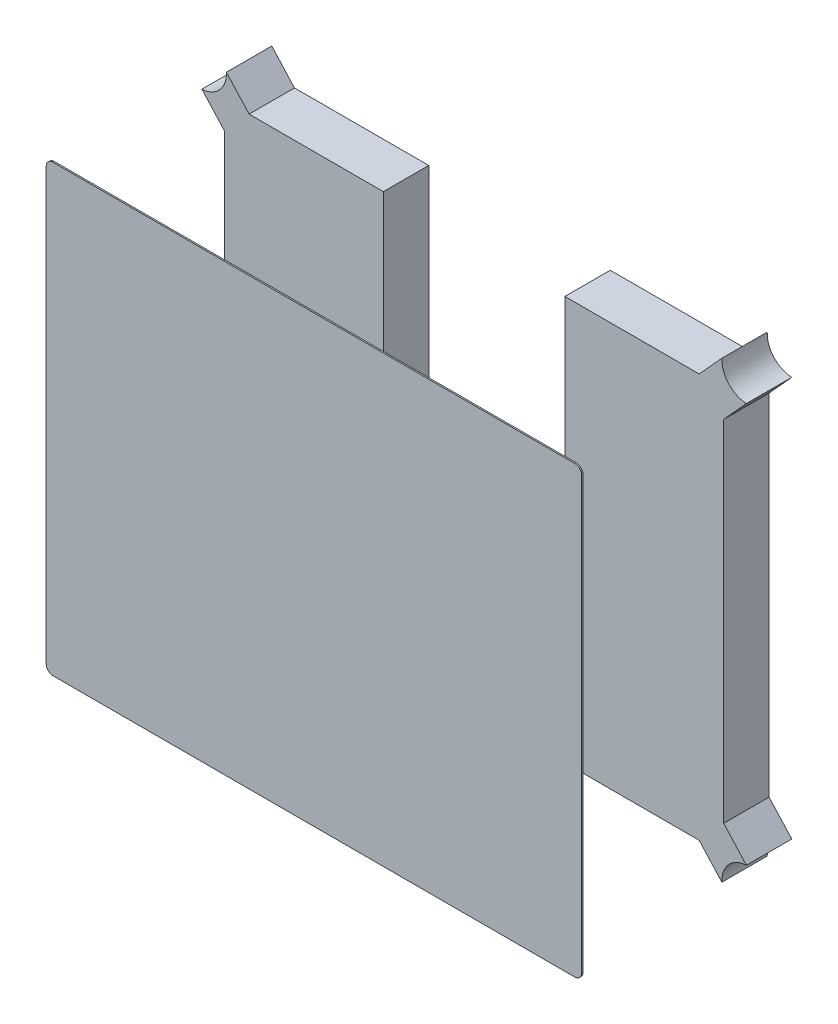
ISO-10303-21;
HEADER;
FILE_DESCRIPTION(('STEP AP214'),'2;1');
FILE_NAME('part.step','',(''),(''),'','','');
FILE_SCHEMA(('AUTOMOTIVE_DESIGN { 1 0 10303 214 1 1 1 1 }'));
ENDSEC;
DATA;
#1=APPLICATION_CONTEXT('core data for automotive mechanical design processes');
#2=APPLICATION_PROTOCOL_DEFINITION('international standard','automotive_design',2000,#1);
#3=PRODUCT_CONTEXT('',#1,'mechanical');
#4=PRODUCT('Part','Part','',(#3));
#5=PRODUCT_RELATED_PRODUCT_CATEGORY('part','',(#4));
#6=PRODUCT_DEFINITION_FORMATION('','',#4);
#7=PRODUCT_DEFINITION_CONTEXT('part definition',#1,'design');
#8=PRODUCT_DEFINITION('design','',#6,#7);
#9=PRODUCT_DEFINITION_SHAPE('','',#8);
#10=(LENGTH_UNIT() NAMED_UNIT(*) SI_UNIT(.MILLI.,.METRE.));
#11=(NAMED_UNIT(*) PLANE_ANGLE_UNIT() SI_UNIT($,.RADIAN.));
#12=(NAMED_UNIT(*) SI_UNIT($,.STERADIAN.) SOLID_ANGLE_UNIT());
#13=UNCERTAINTY_MEASURE_WITH_UNIT(LENGTH_MEASURE(1.E-05),#10,'distance_accuracy_value','');
#14=(GEOMETRIC_REPRESENTATION_CONTEXT(3) GLOBAL_UNCERTAINTY_ASSIGNED_CONTEXT((#13)) GLOBAL_UNIT_ASSIGNED_CONTEXT((#10,
#11,#12)) REPRESENTATION_CONTEXT('',''));
#15=CARTESIAN_POINT('',(0.,0.,0.));
#16=DIRECTION('',(0.,0.,1.));
#17=DIRECTION('',(1.,0.,0.));
#18=AXIS2_PLACEMENT_3D('',#15,#16,#17);
#19=CARTESIAN_POINT('',(-5.75000066,3.74999934,0.45));
#20=DIRECTION('',(0.,0.,1.));
#21=DIRECTION('',(1.,0.,0.));
#22=AXIS2_PLACEMENT_3D('',#19,#20,#21);
#23=PLANE('',#22);
#24=DIRECTION('',(1.,0.,0.));
#25=VECTOR('',#24,1.);
#26=CARTESIAN_POINT('',(-6.32500066,3.25999934,0.45));
#27=LINE('',#26,#25);
#28=CARTESIAN_POINT('',(-6.32500066,3.25999934,0.45));
#29=VERTEX_POINT('',#28);
#30=CARTESIAN_POINT('',(-5.17500066,3.25999934,0.45));
#31=VERTEX_POINT('',#30);
#32=EDGE_CURVE('P0_E82',#29,#31,#27,.T.);
#33=ORIENTED_EDGE('',*,*,#32,.F.);
#34=CARTESIAN_POINT('',(-6.32500066,3.27499934,0.45));
#35=DIRECTION('',(0.,0.,1.));
#36=DIRECTION('',(1.,0.,0.));
#37=AXIS2_PLACEMENT_3D('',#34,#35,#36);
#38=CIRCLE('',#37,0.015);
#39=CARTESIAN_POINT('',(-6.34000066,3.27499934,0.45));
#40=VERTEX_POINT('',#39);
#41=EDGE_CURVE('P0_E98',#40,#29,#38,.T.);
#42=ORIENTED_EDGE('',*,*,#41,.F.);
#43=DIRECTION('',(0.,1.,0.));
#44=VECTOR('',#43,1.);
#45=CARTESIAN_POINT('',(-6.34000066,4.22499934,0.45));
#46=LINE('',#45,#44);
#47=CARTESIAN_POINT('',(-6.34000066,4.22499934,0.45));
#48=VERTEX_POINT('',#47);
#49=EDGE_CURVE('P0_E104',#48,#40,#46,.F.);
#50=ORIENTED_EDGE('',*,*,#49,.F.);
#51=CARTESIAN_POINT('',(-6.32500066,4.22499934,0.45));
#52=DIRECTION('',(0.,0.,1.));
#53=DIRECTION('',(1.,0.,0.));
#54=AXIS2_PLACEMENT_3D('',#51,#52,#53);
#55=CIRCLE('',#54,0.015);
#56=CARTESIAN_POINT('',(-6.32500066,4.23999934,0.45));
#57=VERTEX_POINT('',#56);
#58=EDGE_CURVE('P0_E128',#57,#48,#55,.T.);
#59=ORIENTED_EDGE('',*,*,#58,.F.);
#60=DIRECTION('',(1.,0.,0.));
#61=VECTOR('',#60,1.);
#62=CARTESIAN_POINT('',(-5.17500066,4.23999934,0.45));
#63=LINE('',#62,#61);
#64=CARTESIAN_POINT('',(-5.17500066,4.23999934,0.45));
#65=VERTEX_POINT('',#64);
#66=EDGE_CURVE('P0_E109',#65,#57,#63,.F.);
#67=ORIENTED_EDGE('',*,*,#66,.F.);
#68=CARTESIAN_POINT('',(-5.17500066,4.22499934,0.45));
#69=DIRECTION('',(0.,0.,1.));
#70=DIRECTION('',(1.,0.,0.));
#71=AXIS2_PLACEMENT_3D('',#68,#69,#70);
#72=CIRCLE('',#71,0.015);
#73=CARTESIAN_POINT('',(-5.16000066,4.22499934,0.45));
#74=VERTEX_POINT('',#73);
#75=EDGE_CURVE('P0_E130',#74,#65,#72,.T.);
#76=ORIENTED_EDGE('',*,*,#75,.F.);
#77=DIRECTION('',(0.,1.,0.));
#78=VECTOR('',#77,1.);
#79=CARTESIAN_POINT('',(-5.16000066,3.27499934,0.45));
#80=LINE('',#79,#78);
#81=CARTESIAN_POINT('',(-5.16000066,3.27499934,0.45));
#82=VERTEX_POINT('',#81);
#83=EDGE_CURVE('P0_E84',#82,#74,#80,.T.);
#84=ORIENTED_EDGE('',*,*,#83,.F.);
#85=CARTESIAN_POINT('',(-5.17500066,3.27499934,0.45));
#86=DIRECTION('',(0.,0.,1.));
#87=DIRECTION('',(1.,0.,0.));
#88=AXIS2_PLACEMENT_3D('',#85,#86,#87);
#89=CIRCLE('',#88,0.015);
#90=EDGE_CURVE('P0_E20',#31,#82,#89,.T.);
#91=ORIENTED_EDGE('',*,*,#90,.F.);
#92=EDGE_LOOP('',(#33,#42,#50,#59,#67,#76,#84,#91));
#93=FACE_BOUND('',#92,.T.);
#94=ADVANCED_FACE('P0_F17',(#93),#23,.F.);
#95=CARTESIAN_POINT('',(-5.17500066,3.27499934,0.45));
#96=DIRECTION('',(0.,0.,1.));
#97=DIRECTION('',(1.,0.,0.));
#98=AXIS2_PLACEMENT_3D('',#95,#96,#97);
#99=CYLINDRICAL_SURFACE('',#98,0.015);
#100=CARTESIAN_POINT('',(-5.17500066,3.27499934,0.453));
#101=DIRECTION('',(0.,0.,1.));
#102=DIRECTION('',(1.,0.,0.));
#103=AXIS2_PLACEMENT_3D('',#100,#101,#102);
#104=CIRCLE('',#103,0.015);
#105=CARTESIAN_POINT('',(-5.17500066,3.25999934,0.453));
#106=VERTEX_POINT('',#105);
#107=CARTESIAN_POINT('',(-5.16000066,3.27499934,0.453));
#108=VERTEX_POINT('',#107);
#109=EDGE_CURVE('P0_E91',#106,#108,#104,.T.);
#110=ORIENTED_EDGE('',*,*,#109,.F.);
#111=DIRECTION('',(0.,0.,-1.));
#112=VECTOR('',#111,1.);
#113=CARTESIAN_POINT('',(-5.17500066,3.25999934,0.45));
#114=LINE('',#113,#112);
#115=EDGE_CURVE('P0_E88',#31,#106,#114,.F.);
#116=ORIENTED_EDGE('',*,*,#115,.F.);
#117=ORIENTED_EDGE('',*,*,#90,.T.);
#118=DIRECTION('',(0.,0.,-1.));
#119=VECTOR('',#118,1.);
#120=CARTESIAN_POINT('',(-5.16000066,3.27499934,0.45));
#121=LINE('',#120,#119);
#122=EDGE_CURVE('P0_E102',#108,#82,#121,.T.);
#123=ORIENTED_EDGE('',*,*,#122,.F.);
#124=EDGE_LOOP('',(#110,#116,#117,#123));
#125=FACE_BOUND('',#124,.T.);
#126=ADVANCED_FACE('P0_F89',(#125),#99,.T.);
#127=CARTESIAN_POINT('',(-5.16000066,3.27499934,0.45));
#128=DIRECTION('',(1.,0.,0.));
#129=DIRECTION('',(0.,0.,-1.));
#130=AXIS2_PLACEMENT_3D('',#127,#128,#129);
#131=PLANE('',#130);
#132=DIRECTION('',(0.,1.,0.));
#133=VECTOR('',#132,1.);
#134=CARTESIAN_POINT('',(-5.16000066,3.74999934,0.453));
#135=LINE('',#134,#133);
#136=CARTESIAN_POINT('',(-5.16000066,4.22499934,0.453));
#137=VERTEX_POINT('',#136);
#138=EDGE_CURVE('P0_E125',#108,#137,#135,.T.);
#139=ORIENTED_EDGE('',*,*,#138,.F.);
#140=ORIENTED_EDGE('',*,*,#122,.T.);
#141=ORIENTED_EDGE('',*,*,#83,.T.);
#142=DIRECTION('',(0.,0.,1.));
#143=VECTOR('',#142,1.);
#144=CARTESIAN_POINT('',(-5.16000066,4.22499934,0.45));
#145=LINE('',#144,#143);
#146=EDGE_CURVE('P0_E113',#137,#74,#145,.F.);
#147=ORIENTED_EDGE('',*,*,#146,.F.);
#148=EDGE_LOOP('',(#139,#140,#141,#147));
#149=FACE_BOUND('',#148,.T.);
#150=ADVANCED_FACE('P0_F137',(#149),#131,.T.);
#151=CARTESIAN_POINT('',(-5.17500066,4.22499934,0.45));
#152=DIRECTION('',(0.,0.,1.));
#153=DIRECTION('',(1.,0.,0.));
#154=AXIS2_PLACEMENT_3D('',#151,#152,#153);
#155=CYLINDRICAL_SURFACE('',#154,0.015);
#156=CARTESIAN_POINT('',(-5.17500066,4.22499934,0.453));
#157=DIRECTION('',(0.,0.,1.));
#158=DIRECTION('',(1.,0.,0.));
#159=AXIS2_PLACEMENT_3D('',#156,#157,#158);
#160=CIRCLE('',#159,0.015);
#161=CARTESIAN_POINT('',(-5.17500066,4.23999934,0.453));
#162=VERTEX_POINT('',#161);
#163=EDGE_CURVE('P0_E122',#137,#162,#160,.T.);
#164=ORIENTED_EDGE('',*,*,#163,.F.);
#165=ORIENTED_EDGE('',*,*,#146,.T.);
#166=ORIENTED_EDGE('',*,*,#75,.T.);
#167=DIRECTION('',(0.,0.,1.));
#168=VECTOR('',#167,1.);
#169=CARTESIAN_POINT('',(-5.17500066,4.23999934,0.45));
#170=LINE('',#169,#168);
#171=EDGE_CURVE('P0_E112',#162,#65,#170,.F.);
#172=ORIENTED_EDGE('',*,*,#171,.F.);
#173=EDGE_LOOP('',(#164,#165,#166,#172));
#174=FACE_BOUND('',#173,.T.);
#175=ADVANCED_FACE('P0_F160',(#174),#155,.T.);
#176=CARTESIAN_POINT('',(-5.17500066,4.23999934,0.45));
#177=DIRECTION('',(0.,1.,0.));
#178=DIRECTION('',(0.,0.,1.));
#179=AXIS2_PLACEMENT_3D('',#176,#177,#178);
#180=PLANE('',#179);
#181=DIRECTION('',(1.,0.,0.));
#182=VECTOR('',#181,1.);
#183=CARTESIAN_POINT('',(-5.75000066,4.23999934,0.453));
#184=LINE('',#183,#182);
#185=CARTESIAN_POINT('',(-6.32500066,4.23999934,0.453));
#186=VERTEX_POINT('',#185);
#187=EDGE_CURVE('P0_E121',#162,#186,#184,.F.);
#188=ORIENTED_EDGE('',*,*,#187,.F.);
#189=ORIENTED_EDGE('',*,*,#171,.T.);
#190=ORIENTED_EDGE('',*,*,#66,.T.);
#191=DIRECTION('',(0.,0.,1.));
#192=VECTOR('',#191,1.);
#193=CARTESIAN_POINT('',(-6.32500066,4.23999934,0.45));
#194=LINE('',#193,#192);
#195=EDGE_CURVE('P0_E108',#186,#57,#194,.F.);
#196=ORIENTED_EDGE('',*,*,#195,.F.);
#197=EDGE_LOOP('',(#188,#189,#190,#196));
#198=FACE_BOUND('',#197,.T.);
#199=ADVANCED_FACE('P0_F159',(#198),#180,.T.);
#200=CARTESIAN_POINT('',(-6.32500066,4.22499934,0.45));
#201=DIRECTION('',(0.,0.,1.));
#202=DIRECTION('',(1.,0.,0.));
#203=AXIS2_PLACEMENT_3D('',#200,#201,#202);
#204=CYLINDRICAL_SURFACE('',#203,0.015);
#205=CARTESIAN_POINT('',(-6.32500066,4.22499934,0.453));
#206=DIRECTION('',(0.,0.,1.));
#207=DIRECTION('',(1.,0.,0.));
#208=AXIS2_PLACEMENT_3D('',#205,#206,#207);
#209=CIRCLE('',#208,0.015);
#210=CARTESIAN_POINT('',(-6.34000066,4.22499934,0.453));
#211=VERTEX_POINT('',#210);
#212=EDGE_CURVE('P0_E118',#186,#211,#209,.T.);
#213=ORIENTED_EDGE('',*,*,#212,.F.);
#214=ORIENTED_EDGE('',*,*,#195,.T.);
#215=ORIENTED_EDGE('',*,*,#58,.T.);
#216=DIRECTION('',(0.,0.,1.));
#217=VECTOR('',#216,1.);
#218=CARTESIAN_POINT('',(-6.34000066,4.22499934,0.45));
#219=LINE('',#218,#217);
#220=EDGE_CURVE('P0_E107',#211,#48,#219,.F.);
#221=ORIENTED_EDGE('',*,*,#220,.F.);
#222=EDGE_LOOP('',(#213,#214,#215,#221));
#223=FACE_BOUND('',#222,.T.);
#224=ADVANCED_FACE('P0_F152',(#223),#204,.T.);
#225=CARTESIAN_POINT('',(-6.34000066,4.22499934,0.45));
#226=DIRECTION('',(-1.,0.,0.));
#227=DIRECTION('',(0.,0.,1.));
#228=AXIS2_PLACEMENT_3D('',#225,#226,#227);
#229=PLANE('',#228);
#230=DIRECTION('',(0.,1.,0.));
#231=VECTOR('',#230,1.);
#232=CARTESIAN_POINT('',(-6.34000066,3.74999934,0.453));
#233=LINE('',#232,#231);
#234=CARTESIAN_POINT('',(-6.34000066,3.27499934,0.453));
#235=VERTEX_POINT('',#234);
#236=EDGE_CURVE('P0_E117',#211,#235,#233,.F.);
#237=ORIENTED_EDGE('',*,*,#236,.F.);
#238=ORIENTED_EDGE('',*,*,#220,.T.);
#239=ORIENTED_EDGE('',*,*,#49,.T.);
#240=DIRECTION('',(0.,0.,1.));
#241=VECTOR('',#240,1.);
#242=CARTESIAN_POINT('',(-6.34000066,3.27499934,0.45));
#243=LINE('',#242,#241);
#244=EDGE_CURVE('P0_E95',#235,#40,#243,.F.);
#245=ORIENTED_EDGE('',*,*,#244,.F.);
#246=EDGE_LOOP('',(#237,#238,#239,#245));
#247=FACE_BOUND('',#246,.T.);
#248=ADVANCED_FACE('P0_F147',(#247),#229,.T.);
#249=CARTESIAN_POINT('',(-6.32500066,3.27499934,0.45));
#250=DIRECTION('',(0.,0.,1.));
#251=DIRECTION('',(1.,0.,0.));
#252=AXIS2_PLACEMENT_3D('',#249,#250,#251);
#253=CYLINDRICAL_SURFACE('',#252,0.015);
#254=CARTESIAN_POINT('',(-6.32500066,3.27499934,0.453));
#255=DIRECTION('',(0.,0.,1.));
#256=DIRECTION('',(1.,0.,0.));
#257=AXIS2_PLACEMENT_3D('',#254,#255,#256);
#258=CIRCLE('',#257,0.015);
#259=CARTESIAN_POINT('',(-6.32500066,3.25999934,0.453));
#260=VERTEX_POINT('',#259);
#261=EDGE_CURVE('P0_E26',#235,#260,#258,.T.);
#262=ORIENTED_EDGE('',*,*,#261,.F.);
#263=ORIENTED_EDGE('',*,*,#244,.T.);
#264=ORIENTED_EDGE('',*,*,#41,.T.);
#265=DIRECTION('',(0.,0.,-1.));
#266=VECTOR('',#265,1.);
#267=CARTESIAN_POINT('',(-6.32500066,3.25999934,0.45));
#268=LINE('',#267,#266);
#269=EDGE_CURVE('P0_E35',#260,#29,#268,.T.);
#270=ORIENTED_EDGE('',*,*,#269,.F.);
#271=EDGE_LOOP('',(#262,#263,#264,#270));
#272=FACE_BOUND('',#271,.T.);
#273=ADVANCED_FACE('P0_F145',(#272),#253,.T.);
#274=CARTESIAN_POINT('',(-6.32500066,3.25999934,0.45));
#275=DIRECTION('',(0.,-1.,0.));
#276=DIRECTION('',(0.,0.,-1.));
#277=AXIS2_PLACEMENT_3D('',#274,#275,#276);
#278=PLANE('',#277);
#279=DIRECTION('',(1.,0.,0.));
#280=VECTOR('',#279,1.);
#281=CARTESIAN_POINT('',(-5.75000066,3.25999934,0.453));
#282=LINE('',#281,#280);
#283=EDGE_CURVE('P0_E11',#260,#106,#282,.T.);
#284=ORIENTED_EDGE('',*,*,#283,.F.);
#285=ORIENTED_EDGE('',*,*,#269,.T.);
#286=ORIENTED_EDGE('',*,*,#32,.T.);
#287=ORIENTED_EDGE('',*,*,#115,.T.);
#288=EDGE_LOOP('',(#284,#285,#286,#287));
#289=FACE_BOUND('',#288,.T.);
#290=ADVANCED_FACE('P0_F94',(#289),#278,.T.);
#291=CARTESIAN_POINT('',(-5.75000066,3.74999934,0.453));
#292=DIRECTION('',(0.,0.,1.));
#293=DIRECTION('',(1.,0.,0.));
#294=AXIS2_PLACEMENT_3D('',#291,#292,#293);
#295=PLANE('',#294);
#296=ORIENTED_EDGE('',*,*,#261,.T.);
#297=ORIENTED_EDGE('',*,*,#283,.T.);
#298=ORIENTED_EDGE('',*,*,#109,.T.);
#299=ORIENTED_EDGE('',*,*,#138,.T.);
#300=ORIENTED_EDGE('',*,*,#163,.T.);
#301=ORIENTED_EDGE('',*,*,#187,.T.);
#302=ORIENTED_EDGE('',*,*,#212,.T.);
#303=ORIENTED_EDGE('',*,*,#236,.T.);
#304=EDGE_LOOP('',(#296,#297,#298,#299,#300,#301,#302,#303));
#305=FACE_BOUND('',#304,.T.);
#306=ADVANCED_FACE('P0_F142',(#305),#295,.T.);
#307=CLOSED_SHELL('',(#94,#126,#150,#175,#199,#224,#248,#273,#290,#306));
#308=MANIFOLD_SOLID_BREP('P0_B1',#307);
#309=CARTESIAN_POINT('',(-5.35000066,3.74999934,0.));
#310=DIRECTION('',(0.,0.,1.));
#311=DIRECTION('',(1.,0.,0.));
#312=AXIS2_PLACEMENT_3D('',#309,#310,#311);
#313=PLANE('',#312);
#314=DIRECTION('',(0.672672793996113,-0.739940073396125,0.));
#315=VECTOR('',#314,1.);
#316=CARTESIAN_POINT('',(-5.254059091808,3.30499934,0.));
#317=LINE('',#316,#315);
#318=CARTESIAN_POINT('',(-5.254059091808,3.30499934,0.));
#319=VERTEX_POINT('',#318);
#320=CARTESIAN_POINT('',(-5.20405909180848,3.24999934000049,0.));
#321=VERTEX_POINT('',#320);
#322=EDGE_CURVE('P1_E125',#319,#321,#317,.T.);
#323=ORIENTED_EDGE('',*,*,#322,.F.);
#324=DIRECTION('',(1.,0.,0.));
#325=VECTOR('',#324,1.);
#326=CARTESIAN_POINT('',(-5.55000066,3.30499934,0.));
#327=LINE('',#326,#325);
#328=CARTESIAN_POINT('',(-5.55000066,3.30499934,0.));
#329=VERTEX_POINT('',#328);
#330=EDGE_CURVE('P1_E119',#329,#319,#327,.T.);
#331=ORIENTED_EDGE('',*,*,#330,.F.);
#332=DIRECTION('',(0.,1.,0.));
#333=VECTOR('',#332,1.);
#334=CARTESIAN_POINT('',(-5.55000066,4.19499934,0.));
#335=LINE('',#334,#333);
#336=CARTESIAN_POINT('',(-5.55000066,4.19499934,0.));
#337=VERTEX_POINT('',#336);
#338=EDGE_CURVE('P1_E129',#337,#329,#335,.F.);
#339=ORIENTED_EDGE('',*,*,#338,.F.);
#340=DIRECTION('',(1.,0.,0.));
#341=VECTOR('',#340,1.);
#342=CARTESIAN_POINT('',(-5.254059091808,4.19499934,0.));
#343=LINE('',#342,#341);
#344=CARTESIAN_POINT('',(-5.25405909180799,4.19499934,0.));
#345=VERTEX_POINT('',#344);
#346=EDGE_CURVE('P1_E135',#345,#337,#343,.F.);
#347=ORIENTED_EDGE('',*,*,#346,.F.);
#348=DIRECTION('',(-0.672672793996113,-0.739940073396125,0.));
#349=VECTOR('',#348,1.);
#350=CARTESIAN_POINT('',(-5.204059091808,4.24999934,0.));
#351=LINE('',#350,#349);
#352=CARTESIAN_POINT('',(-5.20405909180847,4.24999933999948,0.));
#353=VERTEX_POINT('',#352);
#354=EDGE_CURVE('P1_E141',#353,#345,#351,.T.);
#355=ORIENTED_EDGE('',*,*,#354,.F.);
#356=CARTESIAN_POINT('',(-5.147293573392,4.24730020479,0.));
#357=DIRECTION('',(0.,0.,1.));
#358=DIRECTION('',(1.,0.,0.));
#359=AXIS2_PLACEMENT_3D('',#356,#357,#358);
#360=CIRCLE('',#359,0.05682965257698);
#361=CARTESIAN_POINT('',(-5.15000065999996,4.19053506501111,0.));
#362=VERTEX_POINT('',#361);
#363=EDGE_CURVE('P1_E144',#353,#362,#360,.T.);
#364=ORIENTED_EDGE('',*,*,#363,.T.);
#365=DIRECTION('',(0.672672793996113,0.739940073396125,0.));
#366=VECTOR('',#365,1.);
#367=CARTESIAN_POINT('',(-5.20000066,4.135535065011,0.));
#368=LINE('',#367,#366);
#369=CARTESIAN_POINT('',(-5.20000066,4.135535065011,0.));
#370=VERTEX_POINT('',#369);
#371=EDGE_CURVE('P1_E147',#370,#362,#368,.T.);
#372=ORIENTED_EDGE('',*,*,#371,.F.);
#373=DIRECTION('',(0.,1.,0.));
#374=VECTOR('',#373,1.);
#375=CARTESIAN_POINT('',(-5.20000066,3.364463614989,0.));
#376=LINE('',#375,#374);
#377=CARTESIAN_POINT('',(-5.20000065999999,3.364463614989,0.));
#378=VERTEX_POINT('',#377);
#379=EDGE_CURVE('P1_E96',#378,#370,#376,.T.);
#380=ORIENTED_EDGE('',*,*,#379,.F.);
#381=DIRECTION('',(-0.672672793996113,0.739940073396125,0.));
#382=VECTOR('',#381,1.);
#383=CARTESIAN_POINT('',(-5.15000066,3.309463614989,0.));
#384=LINE('',#383,#382);
#385=CARTESIAN_POINT('',(-5.15000065999995,3.30946361498895,0.));
#386=VERTEX_POINT('',#385);
#387=EDGE_CURVE('P1_E92',#386,#378,#384,.T.);
#388=ORIENTED_EDGE('',*,*,#387,.F.);
#389=CARTESIAN_POINT('',(-5.147293573392,3.25269847521,0.));
#390=DIRECTION('',(0.,0.,1.));
#391=DIRECTION('',(1.,0.,0.));
#392=AXIS2_PLACEMENT_3D('',#389,#390,#391);
#393=CIRCLE('',#392,0.05682965257698);
#394=EDGE_CURVE('P1_E20',#386,#321,#393,.T.);
#395=ORIENTED_EDGE('',*,*,#394,.T.);
#396=EDGE_LOOP('',(#323,#331,#339,#347,#355,#364,#372,#380,#388,#395));
#397=FACE_BOUND('',#396,.T.);
#398=ADVANCED_FACE('P1_F17',(#397),#313,.F.);
#399=CARTESIAN_POINT('',(-5.147293573392,3.25269847521,0.));
#400=DIRECTION('',(0.,0.,1.));
#401=DIRECTION('',(1.,0.,0.));
#402=AXIS2_PLACEMENT_3D('',#399,#400,#401);
#403=CYLINDRICAL_SURFACE('',#402,0.05682965257698);
#404=DIRECTION('',(0.,0.,1.));
#405=VECTOR('',#404,1.);
#406=CARTESIAN_POINT('',(-5.15000066,3.309463614989,0.));
#407=LINE('',#406,#405);
#408=CARTESIAN_POINT('',(-5.15000065999995,3.30946361498895,0.1));
#409=VERTEX_POINT('',#408);
#410=EDGE_CURVE('P1_E100',#409,#386,#407,.F.);
#411=ORIENTED_EDGE('',*,*,#410,.F.);
#412=CARTESIAN_POINT('',(-5.147293573392,3.25269847521,0.1));
#413=DIRECTION('',(0.,0.,1.));
#414=DIRECTION('',(1.,0.,0.));
#415=AXIS2_PLACEMENT_3D('',#412,#413,#414);
#416=CIRCLE('',#415,0.05682965257698);
#417=CARTESIAN_POINT('',(-5.20405909180848,3.24999934000051,0.1));
#418=VERTEX_POINT('',#417);
#419=EDGE_CURVE('P1_E161',#418,#409,#416,.F.);
#420=ORIENTED_EDGE('',*,*,#419,.F.);
#421=DIRECTION('',(0.,0.,1.));
#422=VECTOR('',#421,1.);
#423=CARTESIAN_POINT('',(-5.20405909180801,3.24999933999999,0.));
#424=LINE('',#423,#422);
#425=EDGE_CURVE('P1_E106',#321,#418,#424,.T.);
#426=ORIENTED_EDGE('',*,*,#425,.F.);
#427=ORIENTED_EDGE('',*,*,#394,.F.);
#428=EDGE_LOOP('',(#411,#420,#426,#427));
#429=FACE_BOUND('',#428,.T.);
#430=ADVANCED_FACE('P1_F103',(#429),#403,.F.);
#431=CARTESIAN_POINT('',(-5.15000066,3.309463614989,0.));
#432=DIRECTION('',(0.739940073396125,0.672672793996113,0.));
#433=DIRECTION('',(-0.672672793996113,0.739940073396125,0.));
#434=AXIS2_PLACEMENT_3D('',#431,#432,#433);
#435=PLANE('',#434);
#436=DIRECTION('',(-0.672672793996311,0.739940073395945,0.));
#437=VECTOR('',#436,1.);
#438=CARTESIAN_POINT('',(-5.15000066,3.309463614989,0.1));
#439=LINE('',#438,#437);
#440=CARTESIAN_POINT('',(-5.20000066,3.364463614989,0.1));
#441=VERTEX_POINT('',#440);
#442=EDGE_CURVE('P1_E110',#409,#441,#439,.T.);
#443=ORIENTED_EDGE('',*,*,#442,.F.);
#444=ORIENTED_EDGE('',*,*,#410,.T.);
#445=ORIENTED_EDGE('',*,*,#387,.T.);
#446=DIRECTION('',(0.,0.,-1.));
#447=VECTOR('',#446,1.);
#448=CARTESIAN_POINT('',(-5.20000066,3.364463614989,0.));
#449=LINE('',#448,#447);
#450=EDGE_CURVE('P1_E113',#441,#378,#449,.T.);
#451=ORIENTED_EDGE('',*,*,#450,.F.);
#452=EDGE_LOOP('',(#443,#444,#445,#451));
#453=FACE_BOUND('',#452,.T.);
#454=ADVANCED_FACE('P1_F108',(#453),#435,.T.);
#455=CARTESIAN_POINT('',(-5.20000066,3.364463614989,0.));
#456=DIRECTION('',(1.,0.,0.));
#457=DIRECTION('',(0.,0.,-1.));
#458=AXIS2_PLACEMENT_3D('',#455,#456,#457);
#459=PLANE('',#458);
#460=DIRECTION('',(0.,1.,0.));
#461=VECTOR('',#460,1.);
#462=CARTESIAN_POINT('',(-5.20000066,3.74999934,0.1));
#463=LINE('',#462,#461);
#464=CARTESIAN_POINT('',(-5.20000066,4.135535065011,0.1));
#465=VERTEX_POINT('',#464);
#466=EDGE_CURVE('P1_E177',#441,#465,#463,.T.);
#467=ORIENTED_EDGE('',*,*,#466,.F.);
#468=ORIENTED_EDGE('',*,*,#450,.T.);
#469=ORIENTED_EDGE('',*,*,#379,.T.);
#470=DIRECTION('',(0.,0.,1.));
#471=VECTOR('',#470,1.);
#472=CARTESIAN_POINT('',(-5.20000066,4.135535065011,0.));
#473=LINE('',#472,#471);
#474=EDGE_CURVE('P1_E149',#465,#370,#473,.F.);
#475=ORIENTED_EDGE('',*,*,#474,.F.);
#476=EDGE_LOOP('',(#467,#468,#469,#475));
#477=FACE_BOUND('',#476,.T.);
#478=ADVANCED_FACE('P1_F183',(#477),#459,.T.);
#479=CARTESIAN_POINT('',(-5.20000066,4.135535065011,0.));
#480=DIRECTION('',(0.739940073396125,-0.672672793996113,0.));
#481=DIRECTION('',(0.672672793996113,0.739940073396125,0.));
#482=AXIS2_PLACEMENT_3D('',#479,#480,#481);
#483=PLANE('',#482);
#484=DIRECTION('',(0.672672793996314,0.739940073395943,0.));
#485=VECTOR('',#484,1.);
#486=CARTESIAN_POINT('',(-5.20000066,4.135535065011,0.1));
#487=LINE('',#486,#485);
#488=CARTESIAN_POINT('',(-5.15000065999995,4.19053506501111,0.1));
#489=VERTEX_POINT('',#488);
#490=EDGE_CURVE('P1_E160',#465,#489,#487,.T.);
#491=ORIENTED_EDGE('',*,*,#490,.F.);
#492=ORIENTED_EDGE('',*,*,#474,.T.);
#493=ORIENTED_EDGE('',*,*,#371,.T.);
#494=DIRECTION('',(0.,0.,1.));
#495=VECTOR('',#494,1.);
#496=CARTESIAN_POINT('',(-5.15000065999999,4.19053506501111,0.));
#497=LINE('',#496,#495);
#498=EDGE_CURVE('P1_E163',#362,#489,#497,.T.);
#499=ORIENTED_EDGE('',*,*,#498,.T.);
#500=EDGE_LOOP('',(#491,#492,#493,#499));
#501=FACE_BOUND('',#500,.T.);
#502=ADVANCED_FACE('P1_F300',(#501),#483,.T.);
#503=CARTESIAN_POINT('',(-5.147293573392,4.24730020479,0.));
#504=DIRECTION('',(0.,0.,1.));
#505=DIRECTION('',(1.,0.,0.));
#506=AXIS2_PLACEMENT_3D('',#503,#504,#505);
#507=CYLINDRICAL_SURFACE('',#506,0.05682965257698);
#508=DIRECTION('',(0.,0.,1.));
#509=VECTOR('',#508,1.);
#510=CARTESIAN_POINT('',(-5.204059091808,4.24999934,0.));
#511=LINE('',#510,#509);
#512=CARTESIAN_POINT('',(-5.20405909180847,4.24999933999948,0.1));
#513=VERTEX_POINT('',#512);
#514=EDGE_CURVE('P1_E138',#513,#353,#511,.F.);
#515=ORIENTED_EDGE('',*,*,#514,.F.);
#516=CARTESIAN_POINT('',(-5.147293573392,4.24730020479,0.1));
#517=DIRECTION('',(0.,0.,1.));
#518=DIRECTION('',(1.,0.,0.));
#519=AXIS2_PLACEMENT_3D('',#516,#517,#518);
#520=CIRCLE('',#519,0.05682965257698);
#521=EDGE_CURVE('P1_E156',#489,#513,#520,.F.);
#522=ORIENTED_EDGE('',*,*,#521,.F.);
#523=ORIENTED_EDGE('',*,*,#498,.F.);
#524=ORIENTED_EDGE('',*,*,#363,.F.);
#525=EDGE_LOOP('',(#515,#522,#523,#524));
#526=FACE_BOUND('',#525,.T.);
#527=ADVANCED_FACE('P1_F231',(#526),#507,.F.);
#528=CARTESIAN_POINT('',(-5.204059091808,4.24999934,0.));
#529=DIRECTION('',(-0.739940073396125,0.672672793996113,0.));
#530=DIRECTION('',(-0.672672793996113,-0.739940073396125,0.));
#531=AXIS2_PLACEMENT_3D('',#528,#529,#530);
#532=PLANE('',#531);
#533=DIRECTION('',(-0.67267279399632,-0.739940073395937,0.));
#534=VECTOR('',#533,1.);
#535=CARTESIAN_POINT('',(-5.204059091808,4.24999934,0.1));
#536=LINE('',#535,#534);
#537=CARTESIAN_POINT('',(-5.254059091808,4.19499934,0.1));
#538=VERTEX_POINT('',#537);
#539=EDGE_CURVE('P1_E159',#513,#538,#536,.T.);
#540=ORIENTED_EDGE('',*,*,#539,.F.);
#541=ORIENTED_EDGE('',*,*,#514,.T.);
#542=ORIENTED_EDGE('',*,*,#354,.T.);
#543=DIRECTION('',(0.,0.,1.));
#544=VECTOR('',#543,1.);
#545=CARTESIAN_POINT('',(-5.254059091808,4.19499934,0.));
#546=LINE('',#545,#544);
#547=EDGE_CURVE('P1_E132',#538,#345,#546,.F.);
#548=ORIENTED_EDGE('',*,*,#547,.F.);
#549=EDGE_LOOP('',(#540,#541,#542,#548));
#550=FACE_BOUND('',#549,.T.);
#551=ADVANCED_FACE('P1_F228',(#550),#532,.T.);
#552=CARTESIAN_POINT('',(-5.254059091808,4.19499934,0.));
#553=DIRECTION('',(0.,1.,0.));
#554=DIRECTION('',(0.,0.,1.));
#555=AXIS2_PLACEMENT_3D('',#552,#553,#554);
#556=PLANE('',#555);
#557=DIRECTION('',(1.,0.,0.));
#558=VECTOR('',#557,1.);
#559=CARTESIAN_POINT('',(-5.35000066,4.19499934,0.1));
#560=LINE('',#559,#558);
#561=CARTESIAN_POINT('',(-5.55000066,4.19499934,0.1));
#562=VERTEX_POINT('',#561);
#563=EDGE_CURVE('P1_E209',#538,#562,#560,.F.);
#564=ORIENTED_EDGE('',*,*,#563,.F.);
#565=ORIENTED_EDGE('',*,*,#547,.T.);
#566=ORIENTED_EDGE('',*,*,#346,.T.);
#567=DIRECTION('',(0.,0.,1.));
#568=VECTOR('',#567,1.);
#569=CARTESIAN_POINT('',(-5.55000066,4.19499934,0.));
#570=LINE('',#569,#568);
#571=EDGE_CURVE('P1_E122',#562,#337,#570,.F.);
#572=ORIENTED_EDGE('',*,*,#571,.F.);
#573=EDGE_LOOP('',(#564,#565,#566,#572));
#574=FACE_BOUND('',#573,.T.);
#575=ADVANCED_FACE('P1_F224',(#574),#556,.T.);
#576=CARTESIAN_POINT('',(-5.55000066,4.19499934,0.));
#577=DIRECTION('',(-1.,0.,0.));
#578=DIRECTION('',(0.,0.,1.));
#579=AXIS2_PLACEMENT_3D('',#576,#577,#578);
#580=PLANE('',#579);
#581=DIRECTION('',(0.,1.,0.));
#582=VECTOR('',#581,1.);
#583=CARTESIAN_POINT('',(-5.55000066,3.74999934,0.1));
#584=LINE('',#583,#582);
#585=CARTESIAN_POINT('',(-5.55000066,3.30499934,0.1));
#586=VERTEX_POINT('',#585);
#587=EDGE_CURVE('P1_E200',#562,#586,#584,.F.);
#588=ORIENTED_EDGE('',*,*,#587,.F.);
#589=ORIENTED_EDGE('',*,*,#571,.T.);
#590=ORIENTED_EDGE('',*,*,#338,.T.);
#591=DIRECTION('',(0.,0.,-1.));
#592=VECTOR('',#591,1.);
#593=CARTESIAN_POINT('',(-5.55000066,3.30499934,0.));
#594=LINE('',#593,#592);
#595=EDGE_CURVE('P1_E121',#586,#329,#594,.T.);
#596=ORIENTED_EDGE('',*,*,#595,.F.);
#597=EDGE_LOOP('',(#588,#589,#590,#596));
#598=FACE_BOUND('',#597,.T.);
#599=ADVANCED_FACE('P1_F239',(#598),#580,.T.);
#600=CARTESIAN_POINT('',(-5.55000066,3.30499934,0.));
#601=DIRECTION('',(0.,-1.,0.));
#602=DIRECTION('',(0.,0.,-1.));
#603=AXIS2_PLACEMENT_3D('',#600,#601,#602);
#604=PLANE('',#603);
#605=DIRECTION('',(1.,0.,0.));
#606=VECTOR('',#605,1.);
#607=CARTESIAN_POINT('',(-5.35000066,3.30499934,0.1));
#608=LINE('',#607,#606);
#609=CARTESIAN_POINT('',(-5.254059091808,3.30499934,0.1));
#610=VERTEX_POINT('',#609);
#611=EDGE_CURVE('P1_E26',#586,#610,#608,.T.);
#612=ORIENTED_EDGE('',*,*,#611,.F.);
#613=ORIENTED_EDGE('',*,*,#595,.T.);
#614=ORIENTED_EDGE('',*,*,#330,.T.);
#615=DIRECTION('',(0.,0.,1.));
#616=VECTOR('',#615,1.);
#617=CARTESIAN_POINT('',(-5.254059091808,3.30499934,0.));
#618=LINE('',#617,#616);
#619=EDGE_CURVE('P1_E35',#610,#319,#618,.F.);
#620=ORIENTED_EDGE('',*,*,#619,.F.);
#621=EDGE_LOOP('',(#612,#613,#614,#620));
#622=FACE_BOUND('',#621,.T.);
#623=ADVANCED_FACE('P1_F240',(#622),#604,.T.);
#624=CARTESIAN_POINT('',(-5.254059091808,3.30499934,0.));
#625=DIRECTION('',(-0.739940073396125,-0.672672793996113,0.));
#626=DIRECTION('',(0.672672793996113,-0.739940073396125,0.));
#627=AXIS2_PLACEMENT_3D('',#624,#625,#626);
#628=PLANE('',#627);
#629=DIRECTION('',(0.672672793996314,-0.739940073395942,0.));
#630=VECTOR('',#629,1.);
#631=CARTESIAN_POINT('',(-5.254059091808,3.30499934,0.1));
#632=LINE('',#631,#630);
#633=EDGE_CURVE('P1_E11',#610,#418,#632,.T.);
#634=ORIENTED_EDGE('',*,*,#633,.F.);
#635=ORIENTED_EDGE('',*,*,#619,.T.);
#636=ORIENTED_EDGE('',*,*,#322,.T.);
#637=ORIENTED_EDGE('',*,*,#425,.T.);
#638=EDGE_LOOP('',(#634,#635,#636,#637));
#639=FACE_BOUND('',#638,.T.);
#640=ADVANCED_FACE('P1_F242',(#639),#628,.T.);
#641=CARTESIAN_POINT('',(-5.35000066,3.74999934,0.1));
#642=DIRECTION('',(0.,0.,1.));
#643=DIRECTION('',(1.,0.,0.));
#644=AXIS2_PLACEMENT_3D('',#641,#642,#643);
#645=PLANE('',#644);
#646=ORIENTED_EDGE('',*,*,#611,.T.);
#647=ORIENTED_EDGE('',*,*,#633,.T.);
#648=ORIENTED_EDGE('',*,*,#419,.T.);
#649=ORIENTED_EDGE('',*,*,#442,.T.);
#650=ORIENTED_EDGE('',*,*,#466,.T.);
#651=ORIENTED_EDGE('',*,*,#490,.T.);
#652=ORIENTED_EDGE('',*,*,#521,.T.);
#653=ORIENTED_EDGE('',*,*,#539,.T.);
#654=ORIENTED_EDGE('',*,*,#563,.T.);
#655=ORIENTED_EDGE('',*,*,#587,.T.);
#656=EDGE_LOOP('',(#646,#647,#648,#649,#650,#651,#652,#653,#654,#655));
#657=FACE_BOUND('',#656,.T.);
#658=ADVANCED_FACE('P1_F187',(#657),#645,.T.);
#659=CLOSED_SHELL('',(#398,#430,#454,#478,#502,#527,#551,#575,#599,#623,#640,#658));
#660=MANIFOLD_SOLID_BREP('P1_B1',#659);
#661=CARTESIAN_POINT('',(-6.15000066,3.74999934,0.));
#662=DIRECTION('',(0.,0.,1.));
#663=DIRECTION('',(1.,0.,0.));
#664=AXIS2_PLACEMENT_3D('',#661,#662,#663);
#665=PLANE('',#664);
#666=DIRECTION('',(-0.672672793996113,0.739940073396125,0.));
#667=VECTOR('',#666,1.);
#668=CARTESIAN_POINT('',(-6.245942228192,4.19499934,0.));
#669=LINE('',#668,#667);
#670=CARTESIAN_POINT('',(-6.245942228192,4.19499934,0.));
#671=VERTEX_POINT('',#670);
#672=CARTESIAN_POINT('',(-6.29594222819152,4.2499993399995,0.));
#673=VERTEX_POINT('',#672);
#674=EDGE_CURVE('P2_E125',#671,#673,#669,.T.);
#675=ORIENTED_EDGE('',*,*,#674,.F.);
#676=DIRECTION('',(1.,0.,0.));
#677=VECTOR('',#676,1.);
#678=CARTESIAN_POINT('',(-5.95000066,4.19499934,0.));
#679=LINE('',#678,#677);
#680=CARTESIAN_POINT('',(-5.95000066,4.19499934,0.));
#681=VERTEX_POINT('',#680);
#682=EDGE_CURVE('P2_E119',#681,#671,#679,.F.);
#683=ORIENTED_EDGE('',*,*,#682,.F.);
#684=DIRECTION('',(0.,1.,0.));
#685=VECTOR('',#684,1.);
#686=CARTESIAN_POINT('',(-5.95000066,3.30499934,0.));
#687=LINE('',#686,#685);
#688=CARTESIAN_POINT('',(-5.95000066,3.30499934,0.));
#689=VERTEX_POINT('',#688);
#690=EDGE_CURVE('P2_E129',#689,#681,#687,.T.);
#691=ORIENTED_EDGE('',*,*,#690,.F.);
#692=DIRECTION('',(1.,0.,0.));
#693=VECTOR('',#692,1.);
#694=CARTESIAN_POINT('',(-6.245942228192,3.30499934,0.));
#695=LINE('',#694,#693);
#696=CARTESIAN_POINT('',(-6.24594222819201,3.30499934,0.));
#697=VERTEX_POINT('',#696);
#698=EDGE_CURVE('P2_E135',#697,#689,#695,.T.);
#699=ORIENTED_EDGE('',*,*,#698,.F.);
#700=DIRECTION('',(0.672672793996113,0.739940073396125,0.));
#701=VECTOR('',#700,1.);
#702=CARTESIAN_POINT('',(-6.295942228192,3.24999934,0.));
#703=LINE('',#702,#701);
#704=CARTESIAN_POINT('',(-6.29594222819153,3.24999934000052,0.));
#705=VERTEX_POINT('',#704);
#706=EDGE_CURVE('P2_E141',#705,#697,#703,.T.);
#707=ORIENTED_EDGE('',*,*,#706,.F.);
#708=CARTESIAN_POINT('',(-6.352707746608,3.25269847521,0.));
#709=DIRECTION('',(0.,0.,1.));
#710=DIRECTION('',(1.,0.,0.));
#711=AXIS2_PLACEMENT_3D('',#708,#709,#710);
#712=CIRCLE('',#711,0.05682965257698);
#713=CARTESIAN_POINT('',(-6.35000066000004,3.30946361498889,0.));
#714=VERTEX_POINT('',#713);
#715=EDGE_CURVE('P2_E144',#705,#714,#712,.T.);
#716=ORIENTED_EDGE('',*,*,#715,.T.);
#717=DIRECTION('',(-0.672672793996113,-0.739940073396125,0.));
#718=VECTOR('',#717,1.);
#719=CARTESIAN_POINT('',(-6.30000066,3.364463614989,0.));
#720=LINE('',#719,#718);
#721=CARTESIAN_POINT('',(-6.30000066,3.364463614989,0.));
#722=VERTEX_POINT('',#721);
#723=EDGE_CURVE('P2_E147',#722,#714,#720,.T.);
#724=ORIENTED_EDGE('',*,*,#723,.F.);
#725=DIRECTION('',(0.,1.,0.));
#726=VECTOR('',#725,1.);
#727=CARTESIAN_POINT('',(-6.30000066,4.135535065011,0.));
#728=LINE('',#727,#726);
#729=CARTESIAN_POINT('',(-6.30000066000001,4.135535065011,0.));
#730=VERTEX_POINT('',#729);
#731=EDGE_CURVE('P2_E96',#730,#722,#728,.F.);
#732=ORIENTED_EDGE('',*,*,#731,.F.);
#733=DIRECTION('',(0.672672793996113,-0.739940073396125,0.));
#734=VECTOR('',#733,1.);
#735=CARTESIAN_POINT('',(-6.35000066,4.190535065011,0.));
#736=LINE('',#735,#734);
#737=CARTESIAN_POINT('',(-6.35000066000005,4.19053506501105,0.));
#738=VERTEX_POINT('',#737);
#739=EDGE_CURVE('P2_E92',#738,#730,#736,.T.);
#740=ORIENTED_EDGE('',*,*,#739,.F.);
#741=CARTESIAN_POINT('',(-6.352707746608,4.24730020479,0.));
#742=DIRECTION('',(0.,0.,1.));
#743=DIRECTION('',(1.,0.,0.));
#744=AXIS2_PLACEMENT_3D('',#741,#742,#743);
#745=CIRCLE('',#744,0.05682965257698);
#746=EDGE_CURVE('P2_E20',#738,#673,#745,.T.);
#747=ORIENTED_EDGE('',*,*,#746,.T.);
#748=EDGE_LOOP('',(#675,#683,#691,#699,#707,#716,#724,#732,#740,#747));
#749=FACE_BOUND('',#748,.T.);
#750=ADVANCED_FACE('P2_F17',(#749),#665,.F.);
#751=CARTESIAN_POINT('',(-6.352707746608,4.24730020479,0.));
#752=DIRECTION('',(0.,0.,1.));
#753=DIRECTION('',(1.,0.,0.));
#754=AXIS2_PLACEMENT_3D('',#751,#752,#753);
#755=CYLINDRICAL_SURFACE('',#754,0.05682965257698);
#756=DIRECTION('',(0.,0.,1.));
#757=VECTOR('',#756,1.);
#758=CARTESIAN_POINT('',(-6.35000066,4.190535065011,0.));
#759=LINE('',#758,#757);
#760=CARTESIAN_POINT('',(-6.35000066000005,4.19053506501105,0.1));
#761=VERTEX_POINT('',#760);
#762=EDGE_CURVE('P2_E100',#761,#738,#759,.F.);
#763=ORIENTED_EDGE('',*,*,#762,.F.);
#764=CARTESIAN_POINT('',(-6.352707746608,4.24730020479,0.1));
#765=DIRECTION('',(0.,0.,1.));
#766=DIRECTION('',(1.,0.,0.));
#767=AXIS2_PLACEMENT_3D('',#764,#765,#766);
#768=CIRCLE('',#767,0.05682965257698);
#769=CARTESIAN_POINT('',(-6.29594222819152,4.24999933999949,0.1));
#770=VERTEX_POINT('',#769);
#771=EDGE_CURVE('P2_E161',#770,#761,#768,.F.);
#772=ORIENTED_EDGE('',*,*,#771,.F.);
#773=DIRECTION('',(0.,0.,1.));
#774=VECTOR('',#773,1.);
#775=CARTESIAN_POINT('',(-6.29594222819198,4.24999934000001,0.));
#776=LINE('',#775,#774);
#777=EDGE_CURVE('P2_E106',#673,#770,#776,.T.);
#778=ORIENTED_EDGE('',*,*,#777,.F.);
#779=ORIENTED_EDGE('',*,*,#746,.F.);
#780=EDGE_LOOP('',(#763,#772,#778,#779));
#781=FACE_BOUND('',#780,.T.);
#782=ADVANCED_FACE('P2_F103',(#781),#755,.F.);
#783=CARTESIAN_POINT('',(-6.35000066,4.190535065011,0.));
#784=DIRECTION('',(-0.739940073396125,-0.672672793996113,0.));
#785=DIRECTION('',(0.672672793996113,-0.739940073396125,0.));
#786=AXIS2_PLACEMENT_3D('',#783,#784,#785);
#787=PLANE('',#786);
#788=DIRECTION('',(0.67267279399632,-0.739940073395937,0.));
#789=VECTOR('',#788,1.);
#790=CARTESIAN_POINT('',(-6.35000066,4.190535065011,0.1));
#791=LINE('',#790,#789);
#792=CARTESIAN_POINT('',(-6.30000066,4.135535065011,0.1));
#793=VERTEX_POINT('',#792);
#794=EDGE_CURVE('P2_E110',#761,#793,#791,.T.);
#795=ORIENTED_EDGE('',*,*,#794,.F.);
#796=ORIENTED_EDGE('',*,*,#762,.T.);
#797=ORIENTED_EDGE('',*,*,#739,.T.);
#798=DIRECTION('',(0.,0.,1.));
#799=VECTOR('',#798,1.);
#800=CARTESIAN_POINT('',(-6.30000066,4.135535065011,0.));
#801=LINE('',#800,#799);
#802=EDGE_CURVE('P2_E113',#793,#730,#801,.F.);
#803=ORIENTED_EDGE('',*,*,#802,.F.);
#804=EDGE_LOOP('',(#795,#796,#797,#803));
#805=FACE_BOUND('',#804,.T.);
#806=ADVANCED_FACE('P2_F108',(#805),#787,.T.);
#807=CARTESIAN_POINT('',(-6.30000066,4.135535065011,0.));
#808=DIRECTION('',(-1.,0.,0.));
#809=DIRECTION('',(0.,0.,1.));
#810=AXIS2_PLACEMENT_3D('',#807,#808,#809);
#811=PLANE('',#810);
#812=DIRECTION('',(0.,1.,0.));
#813=VECTOR('',#812,1.);
#814=CARTESIAN_POINT('',(-6.30000066,3.74999934,0.1));
#815=LINE('',#814,#813);
#816=CARTESIAN_POINT('',(-6.30000066,3.364463614989,0.1));
#817=VERTEX_POINT('',#816);
#818=EDGE_CURVE('P2_E177',#793,#817,#815,.F.);
#819=ORIENTED_EDGE('',*,*,#818,.F.);
#820=ORIENTED_EDGE('',*,*,#802,.T.);
#821=ORIENTED_EDGE('',*,*,#731,.T.);
#822=DIRECTION('',(0.,0.,1.));
#823=VECTOR('',#822,1.);
#824=CARTESIAN_POINT('',(-6.30000066,3.364463614989,0.));
#825=LINE('',#824,#823);
#826=EDGE_CURVE('P2_E149',#817,#722,#825,.F.);
#827=ORIENTED_EDGE('',*,*,#826,.F.);
#828=EDGE_LOOP('',(#819,#820,#821,#827));
#829=FACE_BOUND('',#828,.T.);
#830=ADVANCED_FACE('P2_F183',(#829),#811,.T.);
#831=CARTESIAN_POINT('',(-6.30000066,3.364463614989,0.));
#832=DIRECTION('',(-0.739940073396125,0.672672793996113,0.));
#833=DIRECTION('',(-0.672672793996113,-0.739940073396125,0.));
#834=AXIS2_PLACEMENT_3D('',#831,#832,#833);
#835=PLANE('',#834);
#836=DIRECTION('',(-0.672672793996317,-0.73994007339594,0.));
#837=VECTOR('',#836,1.);
#838=CARTESIAN_POINT('',(-6.30000066,3.364463614989,0.1));
#839=LINE('',#838,#837);
#840=CARTESIAN_POINT('',(-6.35000066000005,3.30946361498889,0.1));
#841=VERTEX_POINT('',#840);
#842=EDGE_CURVE('P2_E160',#817,#841,#839,.T.);
#843=ORIENTED_EDGE('',*,*,#842,.F.);
#844=ORIENTED_EDGE('',*,*,#826,.T.);
#845=ORIENTED_EDGE('',*,*,#723,.T.);
#846=DIRECTION('',(0.,0.,1.));
#847=VECTOR('',#846,1.);
#848=CARTESIAN_POINT('',(-6.35000066000001,3.30946361498889,0.));
#849=LINE('',#848,#847);
#850=EDGE_CURVE('P2_E163',#714,#841,#849,.T.);
#851=ORIENTED_EDGE('',*,*,#850,.T.);
#852=EDGE_LOOP('',(#843,#844,#845,#851));
#853=FACE_BOUND('',#852,.T.);
#854=ADVANCED_FACE('P2_F300',(#853),#835,.T.);
#855=CARTESIAN_POINT('',(-6.352707746608,3.25269847521,0.));
#856=DIRECTION('',(0.,0.,1.));
#857=DIRECTION('',(1.,0.,0.));
#858=AXIS2_PLACEMENT_3D('',#855,#856,#857);
#859=CYLINDRICAL_SURFACE('',#858,0.05682965257698);
#860=DIRECTION('',(0.,0.,1.));
#861=VECTOR('',#860,1.);
#862=CARTESIAN_POINT('',(-6.295942228192,3.24999934,0.));
#863=LINE('',#862,#861);
#864=CARTESIAN_POINT('',(-6.29594222819153,3.24999934000052,0.1));
#865=VERTEX_POINT('',#864);
#866=EDGE_CURVE('P2_E138',#865,#705,#863,.F.);
#867=ORIENTED_EDGE('',*,*,#866,.F.);
#868=CARTESIAN_POINT('',(-6.352707746608,3.25269847521,0.1));
#869=DIRECTION('',(0.,0.,1.));
#870=DIRECTION('',(1.,0.,0.));
#871=AXIS2_PLACEMENT_3D('',#868,#869,#870);
#872=CIRCLE('',#871,0.05682965257698);
#873=EDGE_CURVE('P2_E156',#841,#865,#872,.F.);
#874=ORIENTED_EDGE('',*,*,#873,.F.);
#875=ORIENTED_EDGE('',*,*,#850,.F.);
#876=ORIENTED_EDGE('',*,*,#715,.F.);
#877=EDGE_LOOP('',(#867,#874,#875,#876));
#878=FACE_BOUND('',#877,.T.);
#879=ADVANCED_FACE('P2_F231',(#878),#859,.F.);
#880=CARTESIAN_POINT('',(-6.295942228192,3.24999934,0.));
#881=DIRECTION('',(0.739940073396125,-0.672672793996113,0.));
#882=DIRECTION('',(0.672672793996113,0.739940073396125,0.));
#883=AXIS2_PLACEMENT_3D('',#880,#881,#882);
#884=PLANE('',#883);
#885=DIRECTION('',(0.672672793996308,0.739940073395948,0.));
#886=VECTOR('',#885,1.);
#887=CARTESIAN_POINT('',(-6.295942228192,3.24999934,0.1));
#888=LINE('',#887,#886);
#889=CARTESIAN_POINT('',(-6.245942228192,3.30499934,0.1));
#890=VERTEX_POINT('',#889);
#891=EDGE_CURVE('P2_E159',#865,#890,#888,.T.);
#892=ORIENTED_EDGE('',*,*,#891,.F.);
#893=ORIENTED_EDGE('',*,*,#866,.T.);
#894=ORIENTED_EDGE('',*,*,#706,.T.);
#895=DIRECTION('',(0.,0.,-1.));
#896=VECTOR('',#895,1.);
#897=CARTESIAN_POINT('',(-6.245942228192,3.30499934,0.));
#898=LINE('',#897,#896);
#899=EDGE_CURVE('P2_E132',#890,#697,#898,.T.);
#900=ORIENTED_EDGE('',*,*,#899,.F.);
#901=EDGE_LOOP('',(#892,#893,#894,#900));
#902=FACE_BOUND('',#901,.T.);
#903=ADVANCED_FACE('P2_F228',(#902),#884,.T.);
#904=CARTESIAN_POINT('',(-6.245942228192,3.30499934,0.));
#905=DIRECTION('',(0.,-1.,0.));
#906=DIRECTION('',(0.,0.,-1.));
#907=AXIS2_PLACEMENT_3D('',#904,#905,#906);
#908=PLANE('',#907);
#909=DIRECTION('',(1.,0.,0.));
#910=VECTOR('',#909,1.);
#911=CARTESIAN_POINT('',(-6.15000066,3.30499934,0.1));
#912=LINE('',#911,#910);
#913=CARTESIAN_POINT('',(-5.95000066,3.30499934,0.1));
#914=VERTEX_POINT('',#913);
#915=EDGE_CURVE('P2_E209',#890,#914,#912,.T.);
#916=ORIENTED_EDGE('',*,*,#915,.F.);
#917=ORIENTED_EDGE('',*,*,#899,.T.);
#918=ORIENTED_EDGE('',*,*,#698,.T.);
#919=DIRECTION('',(0.,0.,-1.));
#920=VECTOR('',#919,1.);
#921=CARTESIAN_POINT('',(-5.95000066,3.30499934,0.));
#922=LINE('',#921,#920);
#923=EDGE_CURVE('P2_E122',#914,#689,#922,.T.);
#924=ORIENTED_EDGE('',*,*,#923,.F.);
#925=EDGE_LOOP('',(#916,#917,#918,#924));
#926=FACE_BOUND('',#925,.T.);
#927=ADVANCED_FACE('P2_F224',(#926),#908,.T.);
#928=CARTESIAN_POINT('',(-5.95000066,3.30499934,0.));
#929=DIRECTION('',(1.,0.,0.));
#930=DIRECTION('',(0.,0.,-1.));
#931=AXIS2_PLACEMENT_3D('',#928,#929,#930);
#932=PLANE('',#931);
#933=DIRECTION('',(0.,1.,0.));
#934=VECTOR('',#933,1.);
#935=CARTESIAN_POINT('',(-5.95000066,3.74999934,0.1));
#936=LINE('',#935,#934);
#937=CARTESIAN_POINT('',(-5.95000066,4.19499934,0.1));
#938=VERTEX_POINT('',#937);
#939=EDGE_CURVE('P2_E200',#914,#938,#936,.T.);
#940=ORIENTED_EDGE('',*,*,#939,.F.);
#941=ORIENTED_EDGE('',*,*,#923,.T.);
#942=ORIENTED_EDGE('',*,*,#690,.T.);
#943=DIRECTION('',(0.,0.,1.));
#944=VECTOR('',#943,1.);
#945=CARTESIAN_POINT('',(-5.95000066,4.19499934,0.));
#946=LINE('',#945,#944);
#947=EDGE_CURVE('P2_E121',#938,#681,#946,.F.);
#948=ORIENTED_EDGE('',*,*,#947,.F.);
#949=EDGE_LOOP('',(#940,#941,#942,#948));
#950=FACE_BOUND('',#949,.T.);
#951=ADVANCED_FACE('P2_F239',(#950),#932,.T.);
#952=CARTESIAN_POINT('',(-5.95000066,4.19499934,0.));
#953=DIRECTION('',(0.,1.,0.));
#954=DIRECTION('',(0.,0.,1.));
#955=AXIS2_PLACEMENT_3D('',#952,#953,#954);
#956=PLANE('',#955);
#957=DIRECTION('',(1.,0.,0.));
#958=VECTOR('',#957,1.);
#959=CARTESIAN_POINT('',(-6.15000066,4.19499934,0.1));
#960=LINE('',#959,#958);
#961=CARTESIAN_POINT('',(-6.245942228192,4.19499934,0.1));
#962=VERTEX_POINT('',#961);
#963=EDGE_CURVE('P2_E26',#938,#962,#960,.F.);
#964=ORIENTED_EDGE('',*,*,#963,.F.);
#965=ORIENTED_EDGE('',*,*,#947,.T.);
#966=ORIENTED_EDGE('',*,*,#682,.T.);
#967=DIRECTION('',(0.,0.,1.));
#968=VECTOR('',#967,1.);
#969=CARTESIAN_POINT('',(-6.245942228192,4.19499934,0.));
#970=LINE('',#969,#968);
#971=EDGE_CURVE('P2_E35',#962,#671,#970,.F.);
#972=ORIENTED_EDGE('',*,*,#971,.F.);
#973=EDGE_LOOP('',(#964,#965,#966,#972));
#974=FACE_BOUND('',#973,.T.);
#975=ADVANCED_FACE('P2_F240',(#974),#956,.T.);
#976=CARTESIAN_POINT('',(-6.245942228192,4.19499934,0.));
#977=DIRECTION('',(0.739940073396125,0.672672793996113,0.));
#978=DIRECTION('',(-0.672672793996113,0.739940073396125,0.));
#979=AXIS2_PLACEMENT_3D('',#976,#977,#978);
#980=PLANE('',#979);
#981=DIRECTION('',(-0.672672793996314,0.739940073395943,0.));
#982=VECTOR('',#981,1.);
#983=CARTESIAN_POINT('',(-6.245942228192,4.19499934,0.1));
#984=LINE('',#983,#982);
#985=EDGE_CURVE('P2_E11',#962,#770,#984,.T.);
#986=ORIENTED_EDGE('',*,*,#985,.F.);
#987=ORIENTED_EDGE('',*,*,#971,.T.);
#988=ORIENTED_EDGE('',*,*,#674,.T.);
#989=ORIENTED_EDGE('',*,*,#777,.T.);
#990=EDGE_LOOP('',(#986,#987,#988,#989));
#991=FACE_BOUND('',#990,.T.);
#992=ADVANCED_FACE('P2_F242',(#991),#980,.T.);
#993=CARTESIAN_POINT('',(-6.15000066,3.74999934,0.1));
#994=DIRECTION('',(0.,0.,1.));
#995=DIRECTION('',(1.,0.,0.));
#996=AXIS2_PLACEMENT_3D('',#993,#994,#995);
#997=PLANE('',#996);
#998=ORIENTED_EDGE('',*,*,#963,.T.);
#999=ORIENTED_EDGE('',*,*,#985,.T.);
#1000=ORIENTED_EDGE('',*,*,#771,.T.);
#1001=ORIENTED_EDGE('',*,*,#794,.T.);
#1002=ORIENTED_EDGE('',*,*,#818,.T.);
#1003=ORIENTED_EDGE('',*,*,#842,.T.);
#1004=ORIENTED_EDGE('',*,*,#873,.T.);
#1005=ORIENTED_EDGE('',*,*,#891,.T.);
#1006=ORIENTED_EDGE('',*,*,#915,.T.);
#1007=ORIENTED_EDGE('',*,*,#939,.T.);
#1008=EDGE_LOOP('',(#998,#999,#1000,#1001,#1002,#1003,#1004,#1005,#1006,#1007));
#1009=FACE_BOUND('',#1008,.T.);
#1010=ADVANCED_FACE('P2_F187',(#1009),#997,.T.);
#1011=CLOSED_SHELL('',(#750,#782,#806,#830,#854,#879,#903,#927,#951,#975,#992,#1010));
#1012=MANIFOLD_SOLID_BREP('P2_B1',#1011);
#1013=ADVANCED_BREP_SHAPE_REPRESENTATION('',(#18,#308,#660,#1012),#14);
#1014=SHAPE_DEFINITION_REPRESENTATION(#9,#1013);
ENDSEC;
END-ISO-10303-21;
